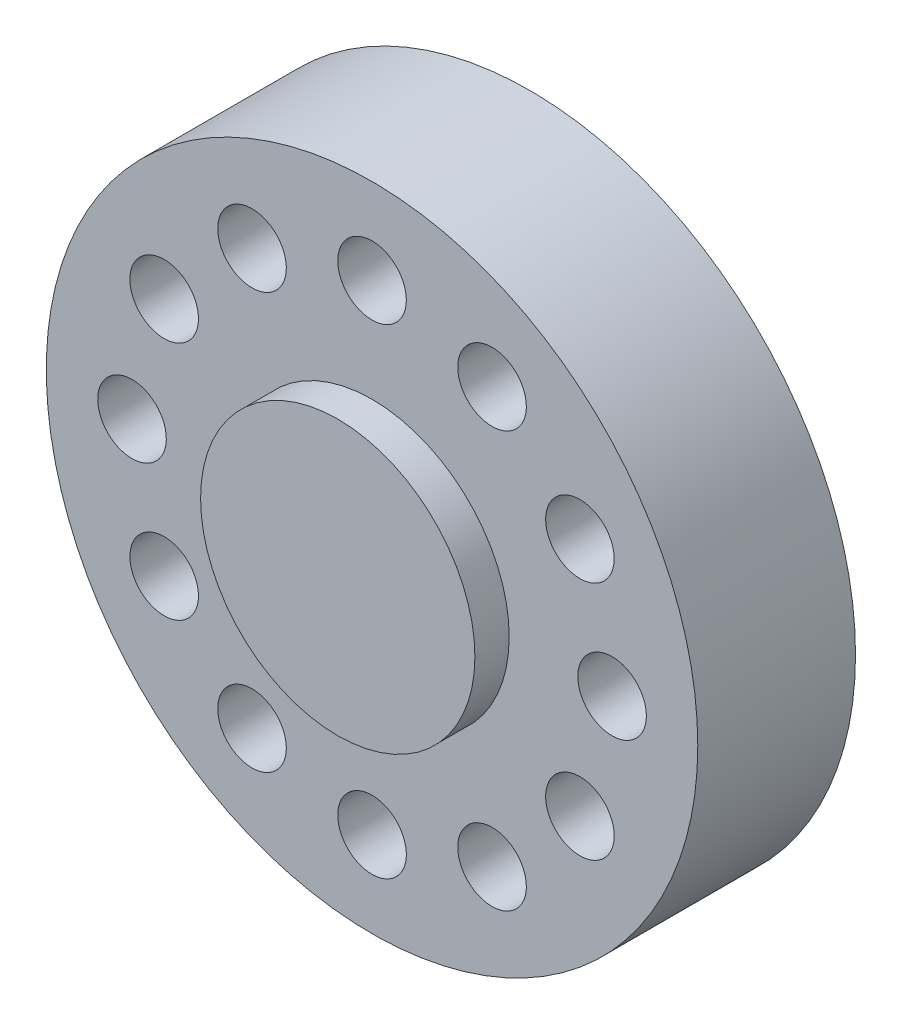
ISO-10303-21;
HEADER;
FILE_DESCRIPTION(('STEP AP214'),'2;1');
FILE_NAME('part.step','',(''),(''),'','','');
FILE_SCHEMA(('AUTOMOTIVE_DESIGN { 1 0 10303 214 1 1 1 1 }'));
ENDSEC;
DATA;
#1=APPLICATION_CONTEXT('core data for automotive mechanical design processes');
#2=APPLICATION_PROTOCOL_DEFINITION('international standard','automotive_design',2000,#1);
#3=PRODUCT_CONTEXT('',#1,'mechanical');
#4=PRODUCT('Part','Part','',(#3));
#5=PRODUCT_RELATED_PRODUCT_CATEGORY('part','',(#4));
#6=PRODUCT_DEFINITION_FORMATION('','',#4);
#7=PRODUCT_DEFINITION_CONTEXT('part definition',#1,'design');
#8=PRODUCT_DEFINITION('design','',#6,#7);
#9=PRODUCT_DEFINITION_SHAPE('','',#8);
#10=(LENGTH_UNIT() NAMED_UNIT(*) SI_UNIT(.MILLI.,.METRE.));
#11=(NAMED_UNIT(*) PLANE_ANGLE_UNIT() SI_UNIT($,.RADIAN.));
#12=(NAMED_UNIT(*) SI_UNIT($,.STERADIAN.) SOLID_ANGLE_UNIT());
#13=UNCERTAINTY_MEASURE_WITH_UNIT(LENGTH_MEASURE(1.E-05),#10,'distance_accuracy_value','');
#14=(GEOMETRIC_REPRESENTATION_CONTEXT(3) GLOBAL_UNCERTAINTY_ASSIGNED_CONTEXT((#13)) GLOBAL_UNIT_ASSIGNED_CONTEXT((#10,
#11,#12)) REPRESENTATION_CONTEXT('',''));
#15=CARTESIAN_POINT('',(0.,0.,0.));
#16=DIRECTION('',(0.,0.,1.));
#17=DIRECTION('',(1.,0.,0.));
#18=AXIS2_PLACEMENT_3D('',#15,#16,#17);
#19=CARTESIAN_POINT('',(-16.7581631194801,25.7617691154423,4.6));
#20=DIRECTION('',(0.,0.,1.));
#21=DIRECTION('',(1.,0.,0.));
#22=AXIS2_PLACEMENT_3D('',#19,#20,#21);
#23=PLANE('',#22);
#24=CARTESIAN_POINT('',(-13.2581631194802,31.8239469419334,4.6));
#25=DIRECTION('',(0.,0.,1.));
#26=DIRECTION('',(0.866025403784445,-0.499999999999989,0.));
#27=AXIS2_PLACEMENT_3D('',#24,#25,#26);
#28=CIRCLE('',#27,1.);
#29=CARTESIAN_POINT('',(-12.3921377156957,31.3239469419334,4.6));
#30=VERTEX_POINT('',#29);
#31=EDGE_CURVE('E116',#30,#30,#28,.T.);
#32=ORIENTED_EDGE('',*,*,#31,.F.);
#33=EDGE_LOOP('',(#32));
#34=FACE_BOUND('',#33,.T.);
#35=CARTESIAN_POINT('',(-10.6959852929891,29.2617691154424,4.6));
#36=DIRECTION('',(0.,0.,1.));
#37=DIRECTION('',(0.50000000000001,-0.866025403784433,0.));
#38=AXIS2_PLACEMENT_3D('',#35,#36,#37);
#39=CIRCLE('',#38,1.);
#40=CARTESIAN_POINT('',(-10.1959852929891,28.3957437116579,4.6));
#41=VERTEX_POINT('',#40);
#42=EDGE_CURVE('E110',#41,#41,#39,.T.);
#43=ORIENTED_EDGE('',*,*,#42,.F.);
#44=EDGE_LOOP('',(#43));
#45=FACE_BOUND('',#44,.T.);
#46=CARTESIAN_POINT('',(-9.75816311948011,25.7617691154424,4.6));
#47=DIRECTION('',(0.,0.,1.));
#48=DIRECTION('',(0.,-1.,0.));
#49=AXIS2_PLACEMENT_3D('',#46,#47,#48);
#50=CIRCLE('',#49,1.);
#51=CARTESIAN_POINT('',(-9.7581631194801,24.7617691154424,4.6));
#52=VERTEX_POINT('',#51);
#53=EDGE_CURVE('E104',#52,#52,#50,.T.);
#54=ORIENTED_EDGE('',*,*,#53,.F.);
#55=EDGE_LOOP('',(#54));
#56=FACE_BOUND('',#55,.T.);
#57=CARTESIAN_POINT('',(-10.695985292989,22.2617691154423,4.6));
#58=DIRECTION('',(0.,0.,1.));
#59=DIRECTION('',(-0.499999999999992,-0.866025403784443,0.));
#60=AXIS2_PLACEMENT_3D('',#57,#58,#59);
#61=CIRCLE('',#60,1.);
#62=CARTESIAN_POINT('',(-11.195985292989,21.3957437116579,4.6));
#63=VERTEX_POINT('',#62);
#64=EDGE_CURVE('E98',#63,#63,#61,.T.);
#65=ORIENTED_EDGE('',*,*,#64,.F.);
#66=EDGE_LOOP('',(#65));
#67=FACE_BOUND('',#66,.T.);
#68=CARTESIAN_POINT('',(-13.2581631194801,19.6995912889512,4.6));
#69=DIRECTION('',(0.,0.,1.));
#70=DIRECTION('',(-0.866025403784435,-0.500000000000007,0.));
#71=AXIS2_PLACEMENT_3D('',#68,#69,#70);
#72=CIRCLE('',#71,1.);
#73=CARTESIAN_POINT('',(-14.1241885232645,19.1995912889512,4.6));
#74=VERTEX_POINT('',#73);
#75=EDGE_CURVE('E92',#74,#74,#72,.T.);
#76=ORIENTED_EDGE('',*,*,#75,.F.);
#77=EDGE_LOOP('',(#76));
#78=FACE_BOUND('',#77,.T.);
#79=CARTESIAN_POINT('',(-16.7581631194801,18.7617691154423,4.6));
#80=DIRECTION('',(0.,0.,1.));
#81=DIRECTION('',(-1.,0.,0.));
#82=AXIS2_PLACEMENT_3D('',#79,#80,#81);
#83=CIRCLE('',#82,1.);
#84=CARTESIAN_POINT('',(-17.7581631194801,18.7617691154423,4.6));
#85=VERTEX_POINT('',#84);
#86=EDGE_CURVE('E86',#85,#85,#83,.T.);
#87=ORIENTED_EDGE('',*,*,#86,.F.);
#88=EDGE_LOOP('',(#87));
#89=FACE_BOUND('',#88,.T.);
#90=CARTESIAN_POINT('',(-20.2581631194801,19.6995912889512,4.6));
#91=DIRECTION('',(0.,0.,1.));
#92=DIRECTION('',(-0.866025403784442,0.499999999999995,0.));
#93=AXIS2_PLACEMENT_3D('',#90,#91,#92);
#94=CIRCLE('',#93,1.);
#95=CARTESIAN_POINT('',(-21.1241885232645,20.1995912889512,4.6));
#96=VERTEX_POINT('',#95);
#97=EDGE_CURVE('E80',#96,#96,#94,.T.);
#98=ORIENTED_EDGE('',*,*,#97,.F.);
#99=EDGE_LOOP('',(#98));
#100=FACE_BOUND('',#99,.T.);
#101=CARTESIAN_POINT('',(-22.8203409459712,22.2617691154423,4.6));
#102=DIRECTION('',(0.,0.,1.));
#103=DIRECTION('',(-0.500000000000004,0.866025403784436,0.));
#104=AXIS2_PLACEMENT_3D('',#101,#102,#103);
#105=CIRCLE('',#104,1.);
#106=CARTESIAN_POINT('',(-23.3203409459712,23.1277945192267,4.6));
#107=VERTEX_POINT('',#106);
#108=EDGE_CURVE('E74',#107,#107,#105,.T.);
#109=ORIENTED_EDGE('',*,*,#108,.F.);
#110=EDGE_LOOP('',(#109));
#111=FACE_BOUND('',#110,.T.);
#112=CARTESIAN_POINT('',(-23.7581631194801,25.7617691154423,4.6));
#113=DIRECTION('',(0.,0.,1.));
#114=DIRECTION('',(0.,1.,0.));
#115=AXIS2_PLACEMENT_3D('',#112,#113,#114);
#116=CIRCLE('',#115,1.);
#117=CARTESIAN_POINT('',(-23.7581631194801,26.7617691154423,4.6));
#118=VERTEX_POINT('',#117);
#119=EDGE_CURVE('E68',#118,#118,#116,.T.);
#120=ORIENTED_EDGE('',*,*,#119,.F.);
#121=EDGE_LOOP('',(#120));
#122=FACE_BOUND('',#121,.T.);
#123=CARTESIAN_POINT('',(-22.8203409459712,29.2617691154423,4.6));
#124=DIRECTION('',(0.,0.,1.));
#125=DIRECTION('',(0.499999999999998,0.86602540378444,0.));
#126=AXIS2_PLACEMENT_3D('',#123,#124,#125);
#127=CIRCLE('',#126,1.);
#128=CARTESIAN_POINT('',(-22.3203409459712,30.1277945192267,4.6));
#129=VERTEX_POINT('',#128);
#130=EDGE_CURVE('E62',#129,#129,#127,.T.);
#131=ORIENTED_EDGE('',*,*,#130,.F.);
#132=EDGE_LOOP('',(#131));
#133=FACE_BOUND('',#132,.T.);
#134=CARTESIAN_POINT('',(-20.2581631194801,31.8239469419334,4.6));
#135=DIRECTION('',(0.,0.,1.));
#136=DIRECTION('',(0.866025403784438,0.500000000000001,0.));
#137=AXIS2_PLACEMENT_3D('',#134,#135,#136);
#138=CIRCLE('',#137,1.);
#139=CARTESIAN_POINT('',(-19.3921377156957,32.3239469419334,4.6));
#140=VERTEX_POINT('',#139);
#141=EDGE_CURVE('E56',#140,#140,#138,.T.);
#142=ORIENTED_EDGE('',*,*,#141,.F.);
#143=EDGE_LOOP('',(#142));
#144=FACE_BOUND('',#143,.T.);
#145=CARTESIAN_POINT('',(-16.7581631194801,32.7617691154423,4.6));
#146=DIRECTION('',(0.,0.,1.));
#147=DIRECTION('',(1.,0.,0.));
#148=AXIS2_PLACEMENT_3D('',#145,#146,#147);
#149=CIRCLE('',#148,1.);
#150=CARTESIAN_POINT('',(-15.7581631194801,32.7617691154423,4.6));
#151=VERTEX_POINT('',#150);
#152=EDGE_CURVE('E50',#151,#151,#149,.T.);
#153=ORIENTED_EDGE('',*,*,#152,.F.);
#154=EDGE_LOOP('',(#153));
#155=FACE_BOUND('',#154,.T.);
#156=CARTESIAN_POINT('',(-16.7581631194801,25.7617691154423,4.6));
#157=DIRECTION('',(0.,0.,1.));
#158=DIRECTION('',(1.,0.,0.));
#159=AXIS2_PLACEMENT_3D('',#156,#157,#158);
#160=CIRCLE('',#159,9.5);
#161=CARTESIAN_POINT('',(-7.25816311948011,25.7617691154423,4.6));
#162=VERTEX_POINT('',#161);
#163=EDGE_CURVE('E10',#162,#162,#160,.T.);
#164=ORIENTED_EDGE('',*,*,#163,.T.);
#165=EDGE_LOOP('',(#164));
#166=FACE_BOUND('',#165,.T.);
#167=CARTESIAN_POINT('',(-16.7581631194801,25.7617691154423,4.6));
#168=DIRECTION('',(0.,0.,1.));
#169=DIRECTION('',(1.,0.,0.));
#170=AXIS2_PLACEMENT_3D('',#167,#168,#169);
#171=CIRCLE('',#170,4.);
#172=CARTESIAN_POINT('',(-12.7581631194801,25.7617691154423,4.6));
#173=VERTEX_POINT('',#172);
#174=EDGE_CURVE('E44',#173,#173,#171,.T.);
#175=ORIENTED_EDGE('',*,*,#174,.F.);
#176=EDGE_LOOP('',(#175));
#177=FACE_BOUND('',#176,.T.);
#178=ADVANCED_FACE('F31',(#34,#45,#56,#67,#78,#89,#100,#111,#122,#133,#144,#155,#166,#177),#23,.T.);
#179=CARTESIAN_POINT('',(-16.7581631194801,25.7617691154423,4.6));
#180=DIRECTION('',(0.,0.,-1.));
#181=DIRECTION('',(-1.,0.,0.));
#182=AXIS2_PLACEMENT_3D('',#179,#180,#181);
#183=CYLINDRICAL_SURFACE('',#182,9.5);
#184=ORIENTED_EDGE('',*,*,#163,.F.);
#185=EDGE_LOOP('',(#184));
#186=FACE_BOUND('',#185,.T.);
#187=CARTESIAN_POINT('',(-16.7581631194801,25.7617691154423,0.));
#188=DIRECTION('',(0.,0.,1.));
#189=DIRECTION('',(1.,0.,0.));
#190=AXIS2_PLACEMENT_3D('',#187,#188,#189);
#191=CIRCLE('',#190,9.5);
#192=CARTESIAN_POINT('',(-7.25816311948011,25.7617691154423,0.));
#193=VERTEX_POINT('',#192);
#194=EDGE_CURVE('E35',#193,#193,#191,.T.);
#195=ORIENTED_EDGE('',*,*,#194,.T.);
#196=EDGE_LOOP('',(#195));
#197=FACE_BOUND('',#196,.T.);
#198=ADVANCED_FACE('F33',(#186,#197),#183,.T.);
#199=CARTESIAN_POINT('',(-16.7581631194801,25.7617691154423,0.));
#200=DIRECTION('',(0.,0.,1.));
#201=DIRECTION('',(1.,0.,0.));
#202=AXIS2_PLACEMENT_3D('',#199,#200,#201);
#203=PLANE('',#202);
#204=CARTESIAN_POINT('',(-13.2581631194802,31.8239469419334,0.));
#205=DIRECTION('',(0.,0.,1.));
#206=DIRECTION('',(0.866025403784445,-0.499999999999989,0.));
#207=AXIS2_PLACEMENT_3D('',#204,#205,#206);
#208=CIRCLE('',#207,1.);
#209=CARTESIAN_POINT('',(-12.3921377156957,31.3239469419334,0.));
#210=VERTEX_POINT('',#209);
#211=EDGE_CURVE('E113',#210,#210,#208,.T.);
#212=ORIENTED_EDGE('',*,*,#211,.T.);
#213=EDGE_LOOP('',(#212));
#214=FACE_BOUND('',#213,.T.);
#215=CARTESIAN_POINT('',(-10.6959852929891,29.2617691154424,0.));
#216=DIRECTION('',(0.,0.,1.));
#217=DIRECTION('',(0.50000000000001,-0.866025403784433,0.));
#218=AXIS2_PLACEMENT_3D('',#215,#216,#217);
#219=CIRCLE('',#218,1.);
#220=CARTESIAN_POINT('',(-10.1959852929891,28.3957437116579,0.));
#221=VERTEX_POINT('',#220);
#222=EDGE_CURVE('E107',#221,#221,#219,.T.);
#223=ORIENTED_EDGE('',*,*,#222,.T.);
#224=EDGE_LOOP('',(#223));
#225=FACE_BOUND('',#224,.T.);
#226=CARTESIAN_POINT('',(-9.75816311948011,25.7617691154424,0.));
#227=DIRECTION('',(0.,0.,1.));
#228=DIRECTION('',(0.,-1.,0.));
#229=AXIS2_PLACEMENT_3D('',#226,#227,#228);
#230=CIRCLE('',#229,1.);
#231=CARTESIAN_POINT('',(-9.7581631194801,24.7617691154424,0.));
#232=VERTEX_POINT('',#231);
#233=EDGE_CURVE('E101',#232,#232,#230,.T.);
#234=ORIENTED_EDGE('',*,*,#233,.T.);
#235=EDGE_LOOP('',(#234));
#236=FACE_BOUND('',#235,.T.);
#237=CARTESIAN_POINT('',(-10.695985292989,22.2617691154423,0.));
#238=DIRECTION('',(0.,0.,1.));
#239=DIRECTION('',(-0.499999999999992,-0.866025403784443,0.));
#240=AXIS2_PLACEMENT_3D('',#237,#238,#239);
#241=CIRCLE('',#240,1.);
#242=CARTESIAN_POINT('',(-11.195985292989,21.3957437116579,0.));
#243=VERTEX_POINT('',#242);
#244=EDGE_CURVE('E95',#243,#243,#241,.T.);
#245=ORIENTED_EDGE('',*,*,#244,.T.);
#246=EDGE_LOOP('',(#245));
#247=FACE_BOUND('',#246,.T.);
#248=CARTESIAN_POINT('',(-13.2581631194801,19.6995912889512,0.));
#249=DIRECTION('',(0.,0.,1.));
#250=DIRECTION('',(-0.866025403784435,-0.500000000000007,0.));
#251=AXIS2_PLACEMENT_3D('',#248,#249,#250);
#252=CIRCLE('',#251,1.);
#253=CARTESIAN_POINT('',(-14.1241885232645,19.1995912889512,0.));
#254=VERTEX_POINT('',#253);
#255=EDGE_CURVE('E89',#254,#254,#252,.T.);
#256=ORIENTED_EDGE('',*,*,#255,.T.);
#257=EDGE_LOOP('',(#256));
#258=FACE_BOUND('',#257,.T.);
#259=CARTESIAN_POINT('',(-16.7581631194801,18.7617691154423,0.));
#260=DIRECTION('',(0.,0.,1.));
#261=DIRECTION('',(-1.,0.,0.));
#262=AXIS2_PLACEMENT_3D('',#259,#260,#261);
#263=CIRCLE('',#262,1.);
#264=CARTESIAN_POINT('',(-17.7581631194801,18.7617691154423,0.));
#265=VERTEX_POINT('',#264);
#266=EDGE_CURVE('E83',#265,#265,#263,.T.);
#267=ORIENTED_EDGE('',*,*,#266,.T.);
#268=EDGE_LOOP('',(#267));
#269=FACE_BOUND('',#268,.T.);
#270=CARTESIAN_POINT('',(-20.2581631194801,19.6995912889512,0.));
#271=DIRECTION('',(0.,0.,1.));
#272=DIRECTION('',(-0.866025403784442,0.499999999999995,0.));
#273=AXIS2_PLACEMENT_3D('',#270,#271,#272);
#274=CIRCLE('',#273,1.);
#275=CARTESIAN_POINT('',(-21.1241885232645,20.1995912889512,0.));
#276=VERTEX_POINT('',#275);
#277=EDGE_CURVE('E77',#276,#276,#274,.T.);
#278=ORIENTED_EDGE('',*,*,#277,.T.);
#279=EDGE_LOOP('',(#278));
#280=FACE_BOUND('',#279,.T.);
#281=CARTESIAN_POINT('',(-22.8203409459712,22.2617691154423,0.));
#282=DIRECTION('',(0.,0.,1.));
#283=DIRECTION('',(-0.500000000000004,0.866025403784436,0.));
#284=AXIS2_PLACEMENT_3D('',#281,#282,#283);
#285=CIRCLE('',#284,1.);
#286=CARTESIAN_POINT('',(-23.3203409459712,23.1277945192267,0.));
#287=VERTEX_POINT('',#286);
#288=EDGE_CURVE('E71',#287,#287,#285,.T.);
#289=ORIENTED_EDGE('',*,*,#288,.T.);
#290=EDGE_LOOP('',(#289));
#291=FACE_BOUND('',#290,.T.);
#292=CARTESIAN_POINT('',(-23.7581631194801,25.7617691154423,0.));
#293=DIRECTION('',(0.,0.,1.));
#294=DIRECTION('',(0.,1.,0.));
#295=AXIS2_PLACEMENT_3D('',#292,#293,#294);
#296=CIRCLE('',#295,1.);
#297=CARTESIAN_POINT('',(-23.7581631194801,26.7617691154423,0.));
#298=VERTEX_POINT('',#297);
#299=EDGE_CURVE('E65',#298,#298,#296,.T.);
#300=ORIENTED_EDGE('',*,*,#299,.T.);
#301=EDGE_LOOP('',(#300));
#302=FACE_BOUND('',#301,.T.);
#303=CARTESIAN_POINT('',(-22.8203409459712,29.2617691154423,0.));
#304=DIRECTION('',(0.,0.,1.));
#305=DIRECTION('',(0.499999999999998,0.86602540378444,0.));
#306=AXIS2_PLACEMENT_3D('',#303,#304,#305);
#307=CIRCLE('',#306,1.);
#308=CARTESIAN_POINT('',(-22.3203409459712,30.1277945192267,0.));
#309=VERTEX_POINT('',#308);
#310=EDGE_CURVE('E59',#309,#309,#307,.T.);
#311=ORIENTED_EDGE('',*,*,#310,.T.);
#312=EDGE_LOOP('',(#311));
#313=FACE_BOUND('',#312,.T.);
#314=CARTESIAN_POINT('',(-20.2581631194801,31.8239469419334,0.));
#315=DIRECTION('',(0.,0.,1.));
#316=DIRECTION('',(0.866025403784438,0.500000000000001,0.));
#317=AXIS2_PLACEMENT_3D('',#314,#315,#316);
#318=CIRCLE('',#317,1.);
#319=CARTESIAN_POINT('',(-19.3921377156957,32.3239469419334,0.));
#320=VERTEX_POINT('',#319);
#321=EDGE_CURVE('E53',#320,#320,#318,.T.);
#322=ORIENTED_EDGE('',*,*,#321,.T.);
#323=EDGE_LOOP('',(#322));
#324=FACE_BOUND('',#323,.T.);
#325=CARTESIAN_POINT('',(-16.7581631194801,32.7617691154423,0.));
#326=DIRECTION('',(0.,0.,1.));
#327=DIRECTION('',(1.,0.,0.));
#328=AXIS2_PLACEMENT_3D('',#325,#326,#327);
#329=CIRCLE('',#328,1.);
#330=CARTESIAN_POINT('',(-15.7581631194801,32.7617691154423,0.));
#331=VERTEX_POINT('',#330);
#332=EDGE_CURVE('E47',#331,#331,#329,.T.);
#333=ORIENTED_EDGE('',*,*,#332,.T.);
#334=EDGE_LOOP('',(#333));
#335=FACE_BOUND('',#334,.T.);
#336=ORIENTED_EDGE('',*,*,#194,.F.);
#337=EDGE_LOOP('',(#336));
#338=FACE_BOUND('',#337,.T.);
#339=ADVANCED_FACE('F122',(#214,#225,#236,#247,#258,#269,#280,#291,#302,#313,#324,#335,#338),
#203,.F.);
#340=CARTESIAN_POINT('',(-16.7581631194801,25.7617691154423,5.6));
#341=DIRECTION('',(0.,0.,-1.));
#342=DIRECTION('',(-1.,0.,0.));
#343=AXIS2_PLACEMENT_3D('',#340,#341,#342);
#344=CYLINDRICAL_SURFACE('',#343,4.);
#345=CARTESIAN_POINT('',(-16.7581631194801,25.7617691154423,5.6));
#346=DIRECTION('',(0.,0.,1.));
#347=DIRECTION('',(1.,0.,0.));
#348=AXIS2_PLACEMENT_3D('',#345,#346,#347);
#349=CIRCLE('',#348,4.);
#350=CARTESIAN_POINT('',(-12.7581631194801,25.7617691154423,5.6));
#351=VERTEX_POINT('',#350);
#352=EDGE_CURVE('E42',#351,#351,#349,.T.);
#353=ORIENTED_EDGE('',*,*,#352,.F.);
#354=EDGE_LOOP('',(#353));
#355=FACE_BOUND('',#354,.T.);
#356=ORIENTED_EDGE('',*,*,#174,.T.);
#357=EDGE_LOOP('',(#356));
#358=FACE_BOUND('',#357,.T.);
#359=ADVANCED_FACE('F159',(#355,#358),#344,.T.);
#360=CARTESIAN_POINT('',(-16.7581631194801,25.7617691154423,5.6));
#361=DIRECTION('',(0.,0.,1.));
#362=DIRECTION('',(1.,0.,0.));
#363=AXIS2_PLACEMENT_3D('',#360,#361,#362);
#364=PLANE('',#363);
#365=ORIENTED_EDGE('',*,*,#352,.T.);
#366=EDGE_LOOP('',(#365));
#367=FACE_BOUND('',#366,.T.);
#368=ADVANCED_FACE('F161',(#367),#364,.T.);
#369=CARTESIAN_POINT('',(-16.7581631194801,32.7617691154423,0.));
#370=DIRECTION('',(0.,0.,1.));
#371=DIRECTION('',(1.,0.,0.));
#372=AXIS2_PLACEMENT_3D('',#369,#370,#371);
#373=CYLINDRICAL_SURFACE('',#372,1.);
#374=ORIENTED_EDGE('',*,*,#332,.F.);
#375=EDGE_LOOP('',(#374));
#376=FACE_BOUND('',#375,.T.);
#377=ORIENTED_EDGE('',*,*,#152,.T.);
#378=EDGE_LOOP('',(#377));
#379=FACE_BOUND('',#378,.T.);
#380=ADVANCED_FACE('F168',(#376,#379),#373,.F.);
#381=CARTESIAN_POINT('',(-20.2581631194801,31.8239469419334,0.));
#382=DIRECTION('',(0.,0.,1.));
#383=DIRECTION('',(1.,0.,0.));
#384=AXIS2_PLACEMENT_3D('',#381,#382,#383);
#385=CYLINDRICAL_SURFACE('',#384,1.);
#386=ORIENTED_EDGE('',*,*,#321,.F.);
#387=EDGE_LOOP('',(#386));
#388=FACE_BOUND('',#387,.T.);
#389=ORIENTED_EDGE('',*,*,#141,.T.);
#390=EDGE_LOOP('',(#389));
#391=FACE_BOUND('',#390,.T.);
#392=ADVANCED_FACE('F175',(#388,#391),#385,.F.);
#393=CARTESIAN_POINT('',(-22.8203409459712,29.2617691154423,0.));
#394=DIRECTION('',(0.,0.,1.));
#395=DIRECTION('',(1.,0.,0.));
#396=AXIS2_PLACEMENT_3D('',#393,#394,#395);
#397=CYLINDRICAL_SURFACE('',#396,1.);
#398=ORIENTED_EDGE('',*,*,#310,.F.);
#399=EDGE_LOOP('',(#398));
#400=FACE_BOUND('',#399,.T.);
#401=ORIENTED_EDGE('',*,*,#130,.T.);
#402=EDGE_LOOP('',(#401));
#403=FACE_BOUND('',#402,.T.);
#404=ADVANCED_FACE('F179',(#400,#403),#397,.F.);
#405=CARTESIAN_POINT('',(-23.7581631194801,25.7617691154423,0.));
#406=DIRECTION('',(0.,0.,1.));
#407=DIRECTION('',(1.,0.,0.));
#408=AXIS2_PLACEMENT_3D('',#405,#406,#407);
#409=CYLINDRICAL_SURFACE('',#408,1.);
#410=ORIENTED_EDGE('',*,*,#299,.F.);
#411=EDGE_LOOP('',(#410));
#412=FACE_BOUND('',#411,.T.);
#413=ORIENTED_EDGE('',*,*,#119,.T.);
#414=EDGE_LOOP('',(#413));
#415=FACE_BOUND('',#414,.T.);
#416=ADVANCED_FACE('F183',(#412,#415),#409,.F.);
#417=CARTESIAN_POINT('',(-22.8203409459712,22.2617691154423,0.));
#418=DIRECTION('',(0.,0.,1.));
#419=DIRECTION('',(1.,0.,0.));
#420=AXIS2_PLACEMENT_3D('',#417,#418,#419);
#421=CYLINDRICAL_SURFACE('',#420,1.);
#422=ORIENTED_EDGE('',*,*,#288,.F.);
#423=EDGE_LOOP('',(#422));
#424=FACE_BOUND('',#423,.T.);
#425=ORIENTED_EDGE('',*,*,#108,.T.);
#426=EDGE_LOOP('',(#425));
#427=FACE_BOUND('',#426,.T.);
#428=ADVANCED_FACE('F187',(#424,#427),#421,.F.);
#429=CARTESIAN_POINT('',(-20.2581631194801,19.6995912889512,0.));
#430=DIRECTION('',(0.,0.,1.));
#431=DIRECTION('',(1.,0.,0.));
#432=AXIS2_PLACEMENT_3D('',#429,#430,#431);
#433=CYLINDRICAL_SURFACE('',#432,1.);
#434=ORIENTED_EDGE('',*,*,#277,.F.);
#435=EDGE_LOOP('',(#434));
#436=FACE_BOUND('',#435,.T.);
#437=ORIENTED_EDGE('',*,*,#97,.T.);
#438=EDGE_LOOP('',(#437));
#439=FACE_BOUND('',#438,.T.);
#440=ADVANCED_FACE('F191',(#436,#439),#433,.F.);
#441=CARTESIAN_POINT('',(-16.7581631194801,18.7617691154423,0.));
#442=DIRECTION('',(0.,0.,1.));
#443=DIRECTION('',(1.,0.,0.));
#444=AXIS2_PLACEMENT_3D('',#441,#442,#443);
#445=CYLINDRICAL_SURFACE('',#444,1.);
#446=ORIENTED_EDGE('',*,*,#266,.F.);
#447=EDGE_LOOP('',(#446));
#448=FACE_BOUND('',#447,.T.);
#449=ORIENTED_EDGE('',*,*,#86,.T.);
#450=EDGE_LOOP('',(#449));
#451=FACE_BOUND('',#450,.T.);
#452=ADVANCED_FACE('F195',(#448,#451),#445,.F.);
#453=CARTESIAN_POINT('',(-13.2581631194801,19.6995912889512,0.));
#454=DIRECTION('',(0.,0.,1.));
#455=DIRECTION('',(1.,0.,0.));
#456=AXIS2_PLACEMENT_3D('',#453,#454,#455);
#457=CYLINDRICAL_SURFACE('',#456,1.);
#458=ORIENTED_EDGE('',*,*,#255,.F.);
#459=EDGE_LOOP('',(#458));
#460=FACE_BOUND('',#459,.T.);
#461=ORIENTED_EDGE('',*,*,#75,.T.);
#462=EDGE_LOOP('',(#461));
#463=FACE_BOUND('',#462,.T.);
#464=ADVANCED_FACE('F199',(#460,#463),#457,.F.);
#465=CARTESIAN_POINT('',(-10.695985292989,22.2617691154423,0.));
#466=DIRECTION('',(0.,0.,1.));
#467=DIRECTION('',(1.,0.,0.));
#468=AXIS2_PLACEMENT_3D('',#465,#466,#467);
#469=CYLINDRICAL_SURFACE('',#468,1.);
#470=ORIENTED_EDGE('',*,*,#244,.F.);
#471=EDGE_LOOP('',(#470));
#472=FACE_BOUND('',#471,.T.);
#473=ORIENTED_EDGE('',*,*,#64,.T.);
#474=EDGE_LOOP('',(#473));
#475=FACE_BOUND('',#474,.T.);
#476=ADVANCED_FACE('F203',(#472,#475),#469,.F.);
#477=CARTESIAN_POINT('',(-9.75816311948011,25.7617691154424,0.));
#478=DIRECTION('',(0.,0.,1.));
#479=DIRECTION('',(1.,0.,0.));
#480=AXIS2_PLACEMENT_3D('',#477,#478,#479);
#481=CYLINDRICAL_SURFACE('',#480,1.);
#482=ORIENTED_EDGE('',*,*,#233,.F.);
#483=EDGE_LOOP('',(#482));
#484=FACE_BOUND('',#483,.T.);
#485=ORIENTED_EDGE('',*,*,#53,.T.);
#486=EDGE_LOOP('',(#485));
#487=FACE_BOUND('',#486,.T.);
#488=ADVANCED_FACE('F207',(#484,#487),#481,.F.);
#489=CARTESIAN_POINT('',(-10.6959852929891,29.2617691154424,0.));
#490=DIRECTION('',(0.,0.,1.));
#491=DIRECTION('',(1.,0.,0.));
#492=AXIS2_PLACEMENT_3D('',#489,#490,#491);
#493=CYLINDRICAL_SURFACE('',#492,1.);
#494=ORIENTED_EDGE('',*,*,#222,.F.);
#495=EDGE_LOOP('',(#494));
#496=FACE_BOUND('',#495,.T.);
#497=ORIENTED_EDGE('',*,*,#42,.T.);
#498=EDGE_LOOP('',(#497));
#499=FACE_BOUND('',#498,.T.);
#500=ADVANCED_FACE('F128',(#496,#499),#493,.F.);
#501=CARTESIAN_POINT('',(-13.2581631194802,31.8239469419334,0.));
#502=DIRECTION('',(0.,0.,1.));
#503=DIRECTION('',(1.,0.,0.));
#504=AXIS2_PLACEMENT_3D('',#501,#502,#503);
#505=CYLINDRICAL_SURFACE('',#504,1.);
#506=ORIENTED_EDGE('',*,*,#211,.F.);
#507=EDGE_LOOP('',(#506));
#508=FACE_BOUND('',#507,.T.);
#509=ORIENTED_EDGE('',*,*,#31,.T.);
#510=EDGE_LOOP('',(#509));
#511=FACE_BOUND('',#510,.T.);
#512=ADVANCED_FACE('F125',(#508,#511),#505,.F.);
#513=CLOSED_SHELL('',(#178,#198,#339,#359,#368,#380,#392,#404,#416,#428,#440,#452,#464,#476,
#488,#500,#512));
#514=MANIFOLD_SOLID_BREP('B2',#513);
#515=ADVANCED_BREP_SHAPE_REPRESENTATION('',(#18,#514),#14);
#516=SHAPE_DEFINITION_REPRESENTATION(#9,#515);
ENDSEC;
END-ISO-10303-21;
